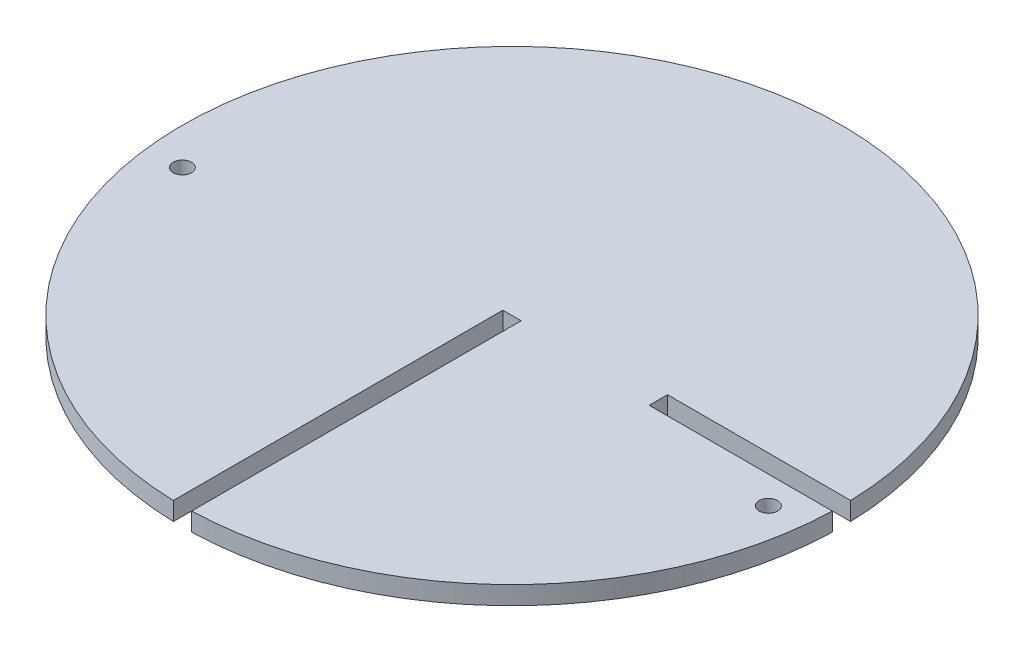
ISO-10303-21;
HEADER;
FILE_DESCRIPTION(('STEP AP214'),'2;1');
FILE_NAME('part.step','',(''),(''),'','','');
FILE_SCHEMA(('AUTOMOTIVE_DESIGN { 1 0 10303 214 1 1 1 1 }'));
ENDSEC;
DATA;
#1=APPLICATION_CONTEXT('core data for automotive mechanical design processes');
#2=APPLICATION_PROTOCOL_DEFINITION('international standard','automotive_design',2000,#1);
#3=PRODUCT_CONTEXT('',#1,'mechanical');
#4=PRODUCT('Part','Part','',(#3));
#5=PRODUCT_RELATED_PRODUCT_CATEGORY('part','',(#4));
#6=PRODUCT_DEFINITION_FORMATION('','',#4);
#7=PRODUCT_DEFINITION_CONTEXT('part definition',#1,'design');
#8=PRODUCT_DEFINITION('design','',#6,#7);
#9=PRODUCT_DEFINITION_SHAPE('','',#8);
#10=(LENGTH_UNIT() NAMED_UNIT(*) SI_UNIT(.MILLI.,.METRE.));
#11=(NAMED_UNIT(*) PLANE_ANGLE_UNIT() SI_UNIT($,.RADIAN.));
#12=(NAMED_UNIT(*) SI_UNIT($,.STERADIAN.) SOLID_ANGLE_UNIT());
#13=UNCERTAINTY_MEASURE_WITH_UNIT(LENGTH_MEASURE(1.E-05),#10,'distance_accuracy_value','');
#14=(GEOMETRIC_REPRESENTATION_CONTEXT(3) GLOBAL_UNCERTAINTY_ASSIGNED_CONTEXT((#13)) GLOBAL_UNIT_ASSIGNED_CONTEXT((#10,
#11,#12)) REPRESENTATION_CONTEXT('',''));
#15=CARTESIAN_POINT('',(0.,0.,0.));
#16=DIRECTION('',(0.,0.,1.));
#17=DIRECTION('',(1.,0.,0.));
#18=AXIS2_PLACEMENT_3D('',#15,#16,#17);
#19=CARTESIAN_POINT('',(0.,6.35,0.));
#20=DIRECTION('',(0.,-1.,0.));
#21=DIRECTION('',(0.,0.,-1.));
#22=AXIS2_PLACEMENT_3D('',#19,#20,#21);
#23=CYLINDRICAL_SURFACE('',#22,114.3);
#24=DIRECTION('',(0.,-1.,0.));
#25=VECTOR('',#24,1.);
#26=CARTESIAN_POINT('',(114.255894268086,6.35,-3.175));
#27=LINE('',#26,#25);
#28=CARTESIAN_POINT('',(114.255894268086,0.,-3.175));
#29=VERTEX_POINT('',#28);
#30=CARTESIAN_POINT('',(114.255894268086,6.35,-3.175));
#31=VERTEX_POINT('',#30);
#32=EDGE_CURVE('E144',#29,#31,#27,.F.);
#33=ORIENTED_EDGE('',*,*,#32,.F.);
#34=CARTESIAN_POINT('',(0.,0.,0.));
#35=DIRECTION('',(0.,1.,0.));
#36=DIRECTION('',(0.,0.,1.));
#37=AXIS2_PLACEMENT_3D('',#34,#35,#36);
#38=CIRCLE('',#37,114.3);
#39=CARTESIAN_POINT('',(-3.17499999999999,0.,114.255894268086));
#40=VERTEX_POINT('',#39);
#41=EDGE_CURVE('E127',#29,#40,#38,.T.);
#42=ORIENTED_EDGE('',*,*,#41,.T.);
#43=DIRECTION('',(0.,-1.,0.));
#44=VECTOR('',#43,1.);
#45=CARTESIAN_POINT('',(-3.17499999999999,6.35,114.255894268086));
#46=LINE('',#45,#44);
#47=CARTESIAN_POINT('',(-3.17499999999999,6.35,114.255894268086));
#48=VERTEX_POINT('',#47);
#49=EDGE_CURVE('E168',#40,#48,#46,.F.);
#50=ORIENTED_EDGE('',*,*,#49,.T.);
#51=CARTESIAN_POINT('',(0.,6.35,0.));
#52=DIRECTION('',(0.,1.,0.));
#53=DIRECTION('',(0.,0.,1.));
#54=AXIS2_PLACEMENT_3D('',#51,#52,#53);
#55=CIRCLE('',#54,114.3);
#56=EDGE_CURVE('E183',#31,#48,#55,.T.);
#57=ORIENTED_EDGE('',*,*,#56,.F.);
#58=EDGE_LOOP('',(#33,#42,#50,#57));
#59=FACE_BOUND('',#58,.T.);
#60=ADVANCED_FACE('F38',(#59),#23,.T.);
#61=CARTESIAN_POINT('',(0.,6.35,0.));
#62=DIRECTION('',(0.,1.,0.));
#63=DIRECTION('',(0.,0.,1.));
#64=AXIS2_PLACEMENT_3D('',#61,#62,#63);
#65=PLANE('',#64);
#66=CARTESIAN_POINT('',(101.6,6.35,12.7));
#67=DIRECTION('',(0.,1.,0.));
#68=DIRECTION('',(0.,0.,1.));
#69=AXIS2_PLACEMENT_3D('',#66,#67,#68);
#70=CIRCLE('',#69,3.175);
#71=CARTESIAN_POINT('',(101.6,6.35,15.875));
#72=VERTEX_POINT('',#71);
#73=EDGE_CURVE('E252',#72,#72,#70,.T.);
#74=ORIENTED_EDGE('',*,*,#73,.F.);
#75=EDGE_LOOP('',(#74));
#76=FACE_BOUND('',#75,.T.);
#77=CARTESIAN_POINT('',(-101.6,6.35,12.7));
#78=DIRECTION('',(0.,1.,0.));
#79=DIRECTION('',(0.,0.,1.));
#80=AXIS2_PLACEMENT_3D('',#77,#78,#79);
#81=CIRCLE('',#80,3.175);
#82=CARTESIAN_POINT('',(-101.6,6.35,15.875));
#83=VERTEX_POINT('',#82);
#84=EDGE_CURVE('E260',#83,#83,#81,.T.);
#85=ORIENTED_EDGE('',*,*,#84,.F.);
#86=EDGE_LOOP('',(#85));
#87=FACE_BOUND('',#86,.T.);
#88=DIRECTION('',(0.,0.,-1.));
#89=VECTOR('',#88,1.);
#90=CARTESIAN_POINT('',(50.7558942680858,6.35,3.175));
#91=LINE('',#90,#89);
#92=CARTESIAN_POINT('',(50.7558942680858,6.35,3.175));
#93=VERTEX_POINT('',#92);
#94=CARTESIAN_POINT('',(50.7558942680858,6.35,-3.175));
#95=VERTEX_POINT('',#94);
#96=EDGE_CURVE('E134',#93,#95,#91,.T.);
#97=ORIENTED_EDGE('',*,*,#96,.T.);
#98=DIRECTION('',(1.,0.,0.));
#99=VECTOR('',#98,1.);
#100=CARTESIAN_POINT('',(114.255894268086,6.35,-3.175));
#101=LINE('',#100,#99);
#102=EDGE_CURVE('E122',#95,#31,#101,.T.);
#103=ORIENTED_EDGE('',*,*,#102,.T.);
#104=ORIENTED_EDGE('',*,*,#56,.T.);
#105=DIRECTION('',(0.,0.,1.));
#106=VECTOR('',#105,1.);
#107=CARTESIAN_POINT('',(-3.17499999999999,6.35,114.3));
#108=LINE('',#107,#106);
#109=CARTESIAN_POINT('',(-3.17499999999999,6.35,0.));
#110=VERTEX_POINT('',#109);
#111=EDGE_CURVE('E152',#110,#48,#108,.T.);
#112=ORIENTED_EDGE('',*,*,#111,.F.);
#113=DIRECTION('',(-1.,0.,0.));
#114=VECTOR('',#113,1.);
#115=CARTESIAN_POINT('',(-3.17499999999999,6.35,0.));
#116=LINE('',#115,#114);
#117=CARTESIAN_POINT('',(3.17500000000001,6.35,0.));
#118=VERTEX_POINT('',#117);
#119=EDGE_CURVE('E158',#118,#110,#116,.T.);
#120=ORIENTED_EDGE('',*,*,#119,.F.);
#121=DIRECTION('',(0.,0.,-1.));
#122=VECTOR('',#121,1.);
#123=CARTESIAN_POINT('',(3.17500000000001,6.35,114.3));
#124=LINE('',#123,#122);
#125=CARTESIAN_POINT('',(3.17500000000001,6.35,114.255894268086));
#126=VERTEX_POINT('',#125);
#127=EDGE_CURVE('E147',#126,#118,#124,.T.);
#128=ORIENTED_EDGE('',*,*,#127,.F.);
#129=CARTESIAN_POINT('',(114.255894268086,6.35,3.175));
#130=VERTEX_POINT('',#129);
#131=EDGE_CURVE('E179',#126,#130,#55,.T.);
#132=ORIENTED_EDGE('',*,*,#131,.T.);
#133=DIRECTION('',(1.,0.,0.));
#134=VECTOR('',#133,1.);
#135=CARTESIAN_POINT('',(50.7558942680858,6.35,3.175));
#136=LINE('',#135,#134);
#137=EDGE_CURVE('E116',#93,#130,#136,.T.);
#138=ORIENTED_EDGE('',*,*,#137,.F.);
#139=EDGE_LOOP('',(#97,#103,#104,#112,#120,#128,#132,#138));
#140=FACE_BOUND('',#139,.T.);
#141=ADVANCED_FACE('F198',(#76,#87,#140),#65,.T.);
#142=CARTESIAN_POINT('',(0.,0.,0.));
#143=DIRECTION('',(0.,1.,0.));
#144=DIRECTION('',(0.,0.,1.));
#145=AXIS2_PLACEMENT_3D('',#142,#143,#144);
#146=PLANE('',#145);
#147=CARTESIAN_POINT('',(101.6,0.,12.7));
#148=DIRECTION('',(0.,1.,0.));
#149=DIRECTION('',(0.,0.,1.));
#150=AXIS2_PLACEMENT_3D('',#147,#148,#149);
#151=CIRCLE('',#150,3.175);
#152=CARTESIAN_POINT('',(101.6,0.,15.875));
#153=VERTEX_POINT('',#152);
#154=EDGE_CURVE('E137',#153,#153,#151,.T.);
#155=ORIENTED_EDGE('',*,*,#154,.T.);
#156=EDGE_LOOP('',(#155));
#157=FACE_BOUND('',#156,.T.);
#158=CARTESIAN_POINT('',(-101.6,0.,12.7));
#159=DIRECTION('',(0.,1.,0.));
#160=DIRECTION('',(0.,0.,1.));
#161=AXIS2_PLACEMENT_3D('',#158,#159,#160);
#162=CIRCLE('',#161,3.175);
#163=CARTESIAN_POINT('',(-101.6,0.,15.875));
#164=VERTEX_POINT('',#163);
#165=EDGE_CURVE('E254',#164,#164,#162,.T.);
#166=ORIENTED_EDGE('',*,*,#165,.T.);
#167=EDGE_LOOP('',(#166));
#168=FACE_BOUND('',#167,.T.);
#169=DIRECTION('',(1.,0.,0.));
#170=VECTOR('',#169,1.);
#171=CARTESIAN_POINT('',(50.7558942680858,0.,-3.175));
#172=LINE('',#171,#170);
#173=CARTESIAN_POINT('',(50.7558942680858,0.,-3.175));
#174=VERTEX_POINT('',#173);
#175=EDGE_CURVE('E115',#174,#29,#172,.T.);
#176=ORIENTED_EDGE('',*,*,#175,.F.);
#177=DIRECTION('',(0.,0.,-1.));
#178=VECTOR('',#177,1.);
#179=CARTESIAN_POINT('',(50.7558942680858,0.,3.175));
#180=LINE('',#179,#178);
#181=CARTESIAN_POINT('',(50.7558942680858,0.,3.175));
#182=VERTEX_POINT('',#181);
#183=EDGE_CURVE('E105',#182,#174,#180,.T.);
#184=ORIENTED_EDGE('',*,*,#183,.F.);
#185=DIRECTION('',(1.,0.,0.));
#186=VECTOR('',#185,1.);
#187=CARTESIAN_POINT('',(0.,0.,3.175));
#188=LINE('',#187,#186);
#189=CARTESIAN_POINT('',(114.255894268086,0.,3.175));
#190=VERTEX_POINT('',#189);
#191=EDGE_CURVE('E11',#182,#190,#188,.T.);
#192=ORIENTED_EDGE('',*,*,#191,.T.);
#193=CARTESIAN_POINT('',(3.17500000000001,0.,114.255894268086));
#194=VERTEX_POINT('',#193);
#195=EDGE_CURVE('E184',#194,#190,#38,.T.);
#196=ORIENTED_EDGE('',*,*,#195,.F.);
#197=DIRECTION('',(0.,0.,-1.));
#198=VECTOR('',#197,1.);
#199=CARTESIAN_POINT('',(3.17500000000001,0.,0.));
#200=LINE('',#199,#198);
#201=CARTESIAN_POINT('',(3.17500000000001,0.,0.));
#202=VERTEX_POINT('',#201);
#203=EDGE_CURVE('E47',#194,#202,#200,.T.);
#204=ORIENTED_EDGE('',*,*,#203,.T.);
#205=DIRECTION('',(-1.,0.,0.));
#206=VECTOR('',#205,1.);
#207=CARTESIAN_POINT('',(-3.17499999999999,0.,0.));
#208=LINE('',#207,#206);
#209=CARTESIAN_POINT('',(-3.17499999999999,0.,0.));
#210=VERTEX_POINT('',#209);
#211=EDGE_CURVE('E148',#202,#210,#208,.T.);
#212=ORIENTED_EDGE('',*,*,#211,.T.);
#213=DIRECTION('',(0.,0.,1.));
#214=VECTOR('',#213,1.);
#215=CARTESIAN_POINT('',(-3.17499999999999,0.,114.3));
#216=LINE('',#215,#214);
#217=EDGE_CURVE('E61',#210,#40,#216,.T.);
#218=ORIENTED_EDGE('',*,*,#217,.T.);
#219=ORIENTED_EDGE('',*,*,#41,.F.);
#220=EDGE_LOOP('',(#176,#184,#192,#196,#204,#212,#218,#219));
#221=FACE_BOUND('',#220,.T.);
#222=ADVANCED_FACE('F126',(#157,#168,#221),#146,.F.);
#223=ORIENTED_EDGE('',*,*,#195,.T.);
#224=DIRECTION('',(0.,-1.,0.));
#225=VECTOR('',#224,1.);
#226=CARTESIAN_POINT('',(114.255894268086,6.35,3.175));
#227=LINE('',#226,#225);
#228=EDGE_CURVE('E54',#190,#130,#227,.F.);
#229=ORIENTED_EDGE('',*,*,#228,.T.);
#230=ORIENTED_EDGE('',*,*,#131,.F.);
#231=DIRECTION('',(0.,-1.,0.));
#232=VECTOR('',#231,1.);
#233=CARTESIAN_POINT('',(3.17500000000001,6.35,114.255894268086));
#234=LINE('',#233,#232);
#235=EDGE_CURVE('E175',#126,#194,#234,.T.);
#236=ORIENTED_EDGE('',*,*,#235,.T.);
#237=EDGE_LOOP('',(#223,#229,#230,#236));
#238=FACE_BOUND('',#237,.T.);
#239=ADVANCED_FACE('F40',(#238),#23,.T.);
#240=CARTESIAN_POINT('',(3.17500000000001,0.,114.3));
#241=DIRECTION('',(1.,0.,0.));
#242=DIRECTION('',(0.,0.,-1.));
#243=AXIS2_PLACEMENT_3D('',#240,#241,#242);
#244=PLANE('',#243);
#245=ORIENTED_EDGE('',*,*,#127,.T.);
#246=DIRECTION('',(0.,1.,0.));
#247=VECTOR('',#246,1.);
#248=CARTESIAN_POINT('',(3.17500000000001,0.,0.));
#249=LINE('',#248,#247);
#250=EDGE_CURVE('E155',#202,#118,#249,.T.);
#251=ORIENTED_EDGE('',*,*,#250,.F.);
#252=ORIENTED_EDGE('',*,*,#203,.F.);
#253=ORIENTED_EDGE('',*,*,#235,.F.);
#254=EDGE_LOOP('',(#245,#251,#252,#253));
#255=FACE_BOUND('',#254,.T.);
#256=ADVANCED_FACE('F192',(#255),#244,.F.);
#257=CARTESIAN_POINT('',(-3.17499999999999,0.,114.3));
#258=DIRECTION('',(-1.,0.,0.));
#259=DIRECTION('',(0.,0.,1.));
#260=AXIS2_PLACEMENT_3D('',#257,#258,#259);
#261=PLANE('',#260);
#262=ORIENTED_EDGE('',*,*,#217,.F.);
#263=DIRECTION('',(0.,1.,0.));
#264=VECTOR('',#263,1.);
#265=CARTESIAN_POINT('',(-3.17499999999999,0.,0.));
#266=LINE('',#265,#264);
#267=EDGE_CURVE('E165',#210,#110,#266,.T.);
#268=ORIENTED_EDGE('',*,*,#267,.T.);
#269=ORIENTED_EDGE('',*,*,#111,.T.);
#270=ORIENTED_EDGE('',*,*,#49,.F.);
#271=EDGE_LOOP('',(#262,#268,#269,#270));
#272=FACE_BOUND('',#271,.T.);
#273=ADVANCED_FACE('F203',(#272),#261,.F.);
#274=CARTESIAN_POINT('',(-3.17499999999999,0.,0.));
#275=DIRECTION('',(0.,0.,-1.));
#276=DIRECTION('',(-1.,0.,0.));
#277=AXIS2_PLACEMENT_3D('',#274,#275,#276);
#278=PLANE('',#277);
#279=ORIENTED_EDGE('',*,*,#119,.T.);
#280=ORIENTED_EDGE('',*,*,#267,.F.);
#281=ORIENTED_EDGE('',*,*,#211,.F.);
#282=ORIENTED_EDGE('',*,*,#250,.T.);
#283=EDGE_LOOP('',(#279,#280,#281,#282));
#284=FACE_BOUND('',#283,.T.);
#285=ADVANCED_FACE('F202',(#284),#278,.F.);
#286=CARTESIAN_POINT('',(114.255894268086,0.,-3.175));
#287=DIRECTION('',(0.,0.,1.));
#288=DIRECTION('',(1.,0.,0.));
#289=AXIS2_PLACEMENT_3D('',#286,#287,#288);
#290=PLANE('',#289);
#291=ORIENTED_EDGE('',*,*,#32,.T.);
#292=ORIENTED_EDGE('',*,*,#102,.F.);
#293=DIRECTION('',(0.,1.,0.));
#294=VECTOR('',#293,1.);
#295=CARTESIAN_POINT('',(50.7558942680858,0.,-3.175));
#296=LINE('',#295,#294);
#297=EDGE_CURVE('E109',#174,#95,#296,.T.);
#298=ORIENTED_EDGE('',*,*,#297,.F.);
#299=ORIENTED_EDGE('',*,*,#175,.T.);
#300=EDGE_LOOP('',(#291,#292,#298,#299));
#301=FACE_BOUND('',#300,.T.);
#302=ADVANCED_FACE('F119',(#301),#290,.T.);
#303=CARTESIAN_POINT('',(50.7558942680858,0.,3.175));
#304=DIRECTION('',(0.,0.,1.));
#305=DIRECTION('',(1.,0.,0.));
#306=AXIS2_PLACEMENT_3D('',#303,#304,#305);
#307=PLANE('',#306);
#308=ORIENTED_EDGE('',*,*,#191,.F.);
#309=DIRECTION('',(0.,1.,0.));
#310=VECTOR('',#309,1.);
#311=CARTESIAN_POINT('',(50.7558942680858,0.,3.175));
#312=LINE('',#311,#310);
#313=EDGE_CURVE('E111',#182,#93,#312,.T.);
#314=ORIENTED_EDGE('',*,*,#313,.T.);
#315=ORIENTED_EDGE('',*,*,#137,.T.);
#316=ORIENTED_EDGE('',*,*,#228,.F.);
#317=EDGE_LOOP('',(#308,#314,#315,#316));
#318=FACE_BOUND('',#317,.T.);
#319=ADVANCED_FACE('F235',(#318),#307,.F.);
#320=CARTESIAN_POINT('',(50.7558942680858,0.,3.175));
#321=DIRECTION('',(1.,0.,0.));
#322=DIRECTION('',(0.,0.,-1.));
#323=AXIS2_PLACEMENT_3D('',#320,#321,#322);
#324=PLANE('',#323);
#325=ORIENTED_EDGE('',*,*,#96,.F.);
#326=ORIENTED_EDGE('',*,*,#313,.F.);
#327=ORIENTED_EDGE('',*,*,#183,.T.);
#328=ORIENTED_EDGE('',*,*,#297,.T.);
#329=EDGE_LOOP('',(#325,#326,#327,#328));
#330=FACE_BOUND('',#329,.T.);
#331=ADVANCED_FACE('F108',(#330),#324,.T.);
#332=CARTESIAN_POINT('',(-101.6,0.,12.7));
#333=DIRECTION('',(0.,1.,0.));
#334=DIRECTION('',(0.,0.,1.));
#335=AXIS2_PLACEMENT_3D('',#332,#333,#334);
#336=CYLINDRICAL_SURFACE('',#335,3.175);
#337=ORIENTED_EDGE('',*,*,#165,.F.);
#338=EDGE_LOOP('',(#337));
#339=FACE_BOUND('',#338,.T.);
#340=ORIENTED_EDGE('',*,*,#84,.T.);
#341=EDGE_LOOP('',(#340));
#342=FACE_BOUND('',#341,.T.);
#343=ADVANCED_FACE('F234',(#339,#342),#336,.F.);
#344=CARTESIAN_POINT('',(101.6,0.,12.7));
#345=DIRECTION('',(0.,1.,0.));
#346=DIRECTION('',(0.,0.,1.));
#347=AXIS2_PLACEMENT_3D('',#344,#345,#346);
#348=CYLINDRICAL_SURFACE('',#347,3.175);
#349=ORIENTED_EDGE('',*,*,#154,.F.);
#350=EDGE_LOOP('',(#349));
#351=FACE_BOUND('',#350,.T.);
#352=ORIENTED_EDGE('',*,*,#73,.T.);
#353=EDGE_LOOP('',(#352));
#354=FACE_BOUND('',#353,.T.);
#355=ADVANCED_FACE('F242',(#351,#354),#348,.F.);
#356=CLOSED_SHELL('',(#60,#141,#222,#239,#256,#273,#285,#302,#319,#331,#343,#355));
#357=MANIFOLD_SOLID_BREP('B2',#356);
#358=ADVANCED_BREP_SHAPE_REPRESENTATION('',(#18,#357),#14);
#359=SHAPE_DEFINITION_REPRESENTATION(#9,#358);
ENDSEC;
END-ISO-10303-21;
